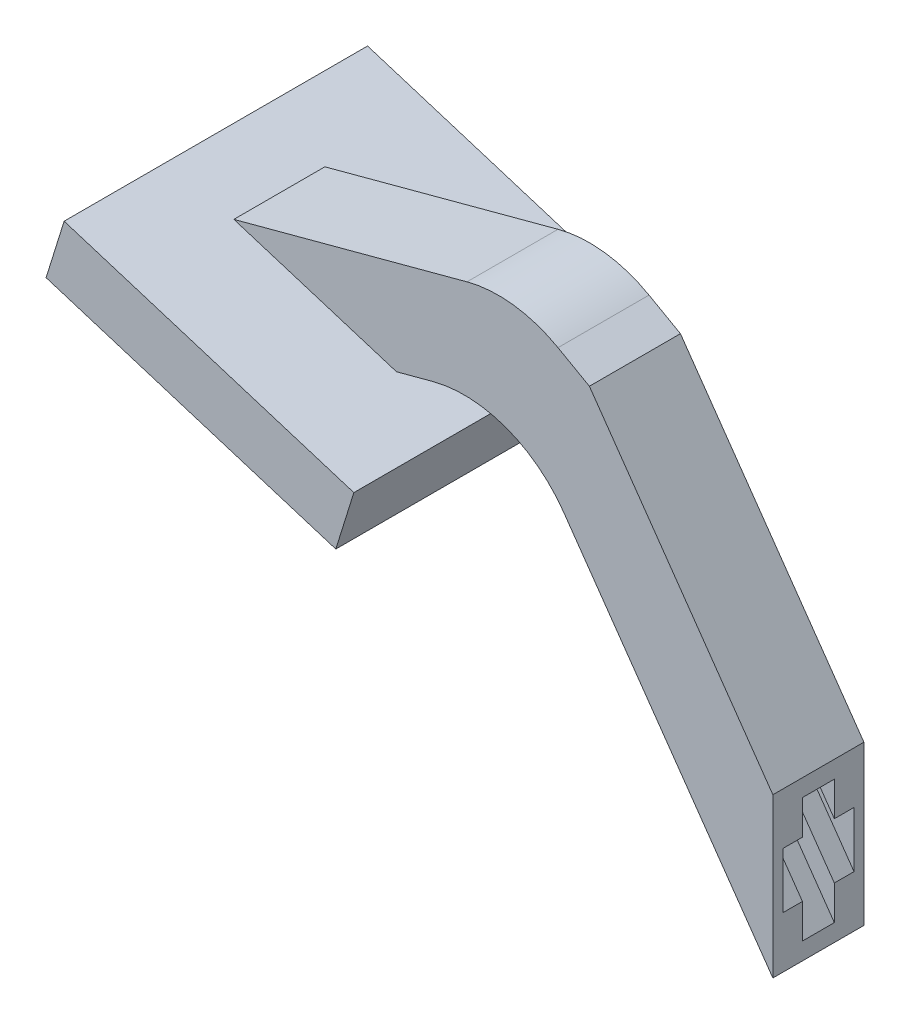
ISO-10303-21;
HEADER;
FILE_DESCRIPTION(('STEP AP214'),'2;1');
FILE_NAME('part.step','',(''),(''),'','','');
FILE_SCHEMA(('AUTOMOTIVE_DESIGN { 1 0 10303 214 1 1 1 1 }'));
ENDSEC;
DATA;
#1=APPLICATION_CONTEXT('core data for automotive mechanical design processes');
#2=APPLICATION_PROTOCOL_DEFINITION('international standard','automotive_design',2000,#1);
#3=PRODUCT_CONTEXT('',#1,'mechanical');
#4=PRODUCT('Part','Part','',(#3));
#5=PRODUCT_RELATED_PRODUCT_CATEGORY('part','',(#4));
#6=PRODUCT_DEFINITION_FORMATION('','',#4);
#7=PRODUCT_DEFINITION_CONTEXT('part definition',#1,'design');
#8=PRODUCT_DEFINITION('design','',#6,#7);
#9=PRODUCT_DEFINITION_SHAPE('','',#8);
#10=(LENGTH_UNIT() NAMED_UNIT(*) SI_UNIT(.MILLI.,.METRE.));
#11=(NAMED_UNIT(*) PLANE_ANGLE_UNIT() SI_UNIT($,.RADIAN.));
#12=(NAMED_UNIT(*) SI_UNIT($,.STERADIAN.) SOLID_ANGLE_UNIT());
#13=UNCERTAINTY_MEASURE_WITH_UNIT(LENGTH_MEASURE(1.E-05),#10,'distance_accuracy_value','');
#14=(GEOMETRIC_REPRESENTATION_CONTEXT(3) GLOBAL_UNCERTAINTY_ASSIGNED_CONTEXT((#13)) GLOBAL_UNIT_ASSIGNED_CONTEXT((#10,
#11,#12)) REPRESENTATION_CONTEXT('',''));
#15=CARTESIAN_POINT('',(0.,0.,0.));
#16=DIRECTION('',(0.,0.,1.));
#17=DIRECTION('',(1.,0.,0.));
#18=AXIS2_PLACEMENT_3D('',#15,#16,#17);
#19=CARTESIAN_POINT('',(-76.7371534076431,20.4290583488844,-5.25000000000002));
#20=DIRECTION('',(0.,0.,-1.));
#21=DIRECTION('',(-1.,3.63042929052426E-13,0.));
#22=AXIS2_PLACEMENT_3D('',#19,#20,#21);
#23=PLANE('',#22);
#24=DIRECTION('',(0.,1.,0.));
#25=VECTOR('',#24,1.);
#26=CARTESIAN_POINT('',(-88.7764695087538,20.4290583488844,-5.25000000000002));
#27=LINE('',#26,#25);
#28=CARTESIAN_POINT('',(-88.7764695087538,44.9863722961307,-5.25000000000002));
#29=VERTEX_POINT('',#28);
#30=CARTESIAN_POINT('',(-88.7764695087538,63.2925636501523,-5.25000000000002));
#31=VERTEX_POINT('',#30);
#32=EDGE_CURVE('E528',#29,#31,#27,.T.);
#33=ORIENTED_EDGE('',*,*,#32,.F.);
#34=DIRECTION('',(0.573576436351044,-0.819152044288993,0.));
#35=VECTOR('',#34,1.);
#36=CARTESIAN_POINT('',(-59.4599154259849,3.1179940182768,-5.25000000000002));
#37=LINE('',#36,#35);
#38=CARTESIAN_POINT('',(-112.919253139753,79.4658406159482,-5.25000000000002));
#39=VERTEX_POINT('',#38);
#40=EDGE_CURVE('E505',#39,#29,#37,.T.);
#41=ORIENTED_EDGE('',*,*,#40,.F.);
#42=CARTESIAN_POINT('',(-124.387381759799,71.4357705070336,-5.25000000000002));
#43=DIRECTION('',(0.,0.,1.));
#44=DIRECTION('',(-1.,0.,0.));
#45=AXIS2_PLACEMENT_3D('',#42,#43,#44);
#46=CIRCLE('',#45,14.);
#47=CARTESIAN_POINT('',(-128.010848391234,84.9587320750806,-5.25000000000002));
#48=VERTEX_POINT('',#47);
#49=EDGE_CURVE('E470',#48,#39,#46,.F.);
#50=ORIENTED_EDGE('',*,*,#49,.F.);
#51=DIRECTION('',(-0.96592582628907,-0.258819045102514,0.));
#52=VECTOR('',#51,1.);
#53=CARTESIAN_POINT('',(-57.1177246506715,103.954487330283,-5.25000000000002));
#54=LINE('',#53,#52);
#55=CARTESIAN_POINT('',(-132.186310495416,83.8399203762381,-5.25000000000002));
#56=VERTEX_POINT('',#55);
#57=EDGE_CURVE('E429',#48,#56,#54,.T.);
#58=ORIENTED_EDGE('',*,*,#57,.T.);
#59=DIRECTION('',(-0.954811797841028,0.297211087787087,0.));
#60=VECTOR('',#59,1.);
#61=CARTESIAN_POINT('',(-150.953412824955,89.681690357072,-5.25000000000002));
#62=LINE('',#61,#60);
#63=CARTESIAN_POINT('',(-150.953412824955,89.681690357072,-5.25000000000002));
#64=VERTEX_POINT('',#63);
#65=EDGE_CURVE('E516',#56,#64,#62,.T.);
#66=ORIENTED_EDGE('',*,*,#65,.T.);
#67=DIRECTION('',(-0.96592582628907,-0.258819045102514,0.));
#68=VECTOR('',#67,1.);
#69=CARTESIAN_POINT('',(-59.8353246242478,114.096708506319,-5.25000000000002));
#70=LINE('',#69,#68);
#71=CARTESIAN_POINT('',(-124.061546630546,96.8873441868295,-5.25000000000002));
#72=VERTEX_POINT('',#71);
#73=EDGE_CURVE('E504',#72,#64,#70,.T.);
#74=ORIENTED_EDGE('',*,*,#73,.F.);
#75=CARTESIAN_POINT('',(-120.438079999111,83.3643826187825,-5.25000000000002));
#76=DIRECTION('',(0.,0.,1.));
#77=DIRECTION('',(-1.,0.,0.));
#78=AXIS2_PLACEMENT_3D('',#75,#76,#77);
#79=CIRCLE('',#78,14.);
#80=CARTESIAN_POINT('',(-113.563943839139,95.5605398846659,-5.25000000000002));
#81=VERTEX_POINT('',#80);
#82=EDGE_CURVE('E484',#81,#72,#79,.T.);
#83=ORIENTED_EDGE('',*,*,#82,.F.);
#84=DIRECTION('',(0.871154090420242,-0.491009725712312,0.));
#85=VECTOR('',#84,1.);
#86=CARTESIAN_POINT('',(-21.6044223151347,43.7292738243126,-5.25000000000002));
#87=LINE('',#86,#85);
#88=CARTESIAN_POINT('',(-109.940872297333,93.5184633065486,-5.25000000000002));
#89=VERTEX_POINT('',#88);
#90=EDGE_CURVE('E513',#81,#89,#87,.T.);
#91=ORIENTED_EDGE('',*,*,#90,.T.);
#92=DIRECTION('',(-0.573576436351044,0.819152044288993,0.));
#93=VECTOR('',#92,1.);
#94=CARTESIAN_POINT('',(-50.8588189609505,9.14054659996277,-5.25000000000002));
#95=LINE('',#94,#93);
#96=EDGE_CURVE('E491',#31,#89,#95,.T.);
#97=ORIENTED_EDGE('',*,*,#96,.F.);
#98=EDGE_LOOP('',(#33,#41,#50,#58,#66,#74,#83,#91,#97));
#99=FACE_BOUND('',#98,.T.);
#100=ADVANCED_FACE('F222',(#99),#23,.T.);
#101=CARTESIAN_POINT('',(-59.4599154259849,3.1179940182768,100.697652672067));
#102=DIRECTION('',(-0.819152044288993,-0.573576436351044,0.));
#103=DIRECTION('',(-0.573576436351044,0.819152044288993,0.));
#104=AXIS2_PLACEMENT_3D('',#101,#102,#103);
#105=PLANE('',#104);
#106=DIRECTION('',(0.,0.,1.));
#107=VECTOR('',#106,1.);
#108=CARTESIAN_POINT('',(-88.7764695087538,44.9863722961307,-9.75000000000002));
#109=LINE('',#108,#107);
#110=CARTESIAN_POINT('',(-88.7764695087538,44.9863722961307,5.24999999999998));
#111=VERTEX_POINT('',#110);
#112=EDGE_CURVE('E246',#29,#111,#109,.T.);
#113=ORIENTED_EDGE('',*,*,#112,.T.);
#114=DIRECTION('',(0.573576436351044,-0.819152044288993,0.));
#115=VECTOR('',#114,1.);
#116=CARTESIAN_POINT('',(-59.4599154259849,3.1179940182768,5.24999999999999));
#117=LINE('',#116,#115);
#118=CARTESIAN_POINT('',(-112.919253139753,79.4658406159482,5.24999999999999));
#119=VERTEX_POINT('',#118);
#120=EDGE_CURVE('E481',#119,#111,#117,.T.);
#121=ORIENTED_EDGE('',*,*,#120,.F.);
#122=DIRECTION('',(0.,0.,-1.));
#123=VECTOR('',#122,1.);
#124=CARTESIAN_POINT('',(-112.919253139753,79.4658406159482,100.697652672067));
#125=LINE('',#124,#123);
#126=EDGE_CURVE('E473',#39,#119,#125,.F.);
#127=ORIENTED_EDGE('',*,*,#126,.F.);
#128=ORIENTED_EDGE('',*,*,#40,.T.);
#129=EDGE_LOOP('',(#113,#121,#127,#128));
#130=FACE_BOUND('',#129,.T.);
#131=ADVANCED_FACE('F629',(#130),#105,.T.);
#132=CARTESIAN_POINT('',(-57.1177246506715,103.954487330283,100.697652672067));
#133=DIRECTION('',(-0.258819045102514,0.96592582628907,0.));
#134=DIRECTION('',(0.96592582628907,0.258819045102514,0.));
#135=AXIS2_PLACEMENT_3D('',#132,#133,#134);
#136=PLANE('',#135);
#137=DIRECTION('',(-0.96592582628907,-0.258819045102514,0.));
#138=VECTOR('',#137,1.);
#139=CARTESIAN_POINT('',(-57.1177246506715,103.954487330283,5.24999999999999));
#140=LINE('',#139,#138);
#141=CARTESIAN_POINT('',(-128.010848391234,84.9587320750806,5.24999999999999));
#142=VERTEX_POINT('',#141);
#143=CARTESIAN_POINT('',(-132.186310495416,83.8399203762381,5.24999999999999));
#144=VERTEX_POINT('',#143);
#145=EDGE_CURVE('E501',#142,#144,#140,.T.);
#146=ORIENTED_EDGE('',*,*,#145,.T.);
#147=DIRECTION('',(0.,0.,1.));
#148=VECTOR('',#147,1.);
#149=CARTESIAN_POINT('',(-132.186310495416,83.8399203762381,-5.25000000000002));
#150=LINE('',#149,#148);
#151=EDGE_CURVE('E496',#56,#144,#150,.T.);
#152=ORIENTED_EDGE('',*,*,#151,.F.);
#153=ORIENTED_EDGE('',*,*,#57,.F.);
#154=DIRECTION('',(0.,0.,-1.));
#155=VECTOR('',#154,1.);
#156=CARTESIAN_POINT('',(-128.010848391234,84.9587320750806,100.697652672067));
#157=LINE('',#156,#155);
#158=EDGE_CURVE('E468',#142,#48,#157,.T.);
#159=ORIENTED_EDGE('',*,*,#158,.F.);
#160=EDGE_LOOP('',(#146,#152,#153,#159));
#161=FACE_BOUND('',#160,.T.);
#162=ADVANCED_FACE('F635',(#161),#136,.F.);
#163=CARTESIAN_POINT('',(-59.8353246242478,114.096708506319,100.697652672067));
#164=DIRECTION('',(-0.258819045102514,0.96592582628907,0.));
#165=DIRECTION('',(0.96592582628907,0.258819045102514,0.));
#166=AXIS2_PLACEMENT_3D('',#163,#164,#165);
#167=PLANE('',#166);
#168=ORIENTED_EDGE('',*,*,#73,.T.);
#169=DIRECTION('',(0.,0.,-1.));
#170=VECTOR('',#169,1.);
#171=CARTESIAN_POINT('',(-150.953412824955,89.681690357072,100.697652672067));
#172=LINE('',#171,#170);
#173=CARTESIAN_POINT('',(-150.953412824955,89.681690357072,5.24999999999998));
#174=VERTEX_POINT('',#173);
#175=EDGE_CURVE('E493',#174,#64,#172,.T.);
#176=ORIENTED_EDGE('',*,*,#175,.F.);
#177=DIRECTION('',(-0.96592582628907,-0.258819045102514,0.));
#178=VECTOR('',#177,1.);
#179=CARTESIAN_POINT('',(-59.8353246242478,114.096708506319,5.24999999999999));
#180=LINE('',#179,#178);
#181=CARTESIAN_POINT('',(-124.061546630546,96.8873441868295,5.24999999999999));
#182=VERTEX_POINT('',#181);
#183=EDGE_CURVE('E500',#182,#174,#180,.T.);
#184=ORIENTED_EDGE('',*,*,#183,.F.);
#185=DIRECTION('',(0.,0.,-1.));
#186=VECTOR('',#185,1.);
#187=CARTESIAN_POINT('',(-124.061546630546,96.8873441868295,5.24999999999999));
#188=LINE('',#187,#186);
#189=EDGE_CURVE('E469',#72,#182,#188,.F.);
#190=ORIENTED_EDGE('',*,*,#189,.F.);
#191=EDGE_LOOP('',(#168,#176,#184,#190));
#192=FACE_BOUND('',#191,.T.);
#193=ADVANCED_FACE('F901',(#192),#167,.T.);
#194=CARTESIAN_POINT('',(-21.6044223151347,43.7292738243126,100.697652672067));
#195=DIRECTION('',(-0.491009725712312,-0.871154090420242,0.));
#196=DIRECTION('',(-0.871154090420242,0.491009725712312,0.));
#197=AXIS2_PLACEMENT_3D('',#194,#195,#196);
#198=PLANE('',#197);
#199=DIRECTION('',(0.871154090420242,-0.491009725712312,0.));
#200=VECTOR('',#199,1.);
#201=CARTESIAN_POINT('',(-21.6044223151347,43.7292738243126,5.24999999999999));
#202=LINE('',#201,#200);
#203=CARTESIAN_POINT('',(-113.563943839139,95.5605398846659,5.24999999999999));
#204=VERTEX_POINT('',#203);
#205=CARTESIAN_POINT('',(-109.940872297333,93.5184633065486,5.24999999999999));
#206=VERTEX_POINT('',#205);
#207=EDGE_CURVE('E492',#204,#206,#202,.T.);
#208=ORIENTED_EDGE('',*,*,#207,.T.);
#209=DIRECTION('',(0.,0.,-1.));
#210=VECTOR('',#209,1.);
#211=CARTESIAN_POINT('',(-109.940872297333,93.5184633065486,100.697652672067));
#212=LINE('',#211,#210);
#213=EDGE_CURVE('E488',#206,#89,#212,.T.);
#214=ORIENTED_EDGE('',*,*,#213,.T.);
#215=ORIENTED_EDGE('',*,*,#90,.F.);
#216=DIRECTION('',(0.,0.,-1.));
#217=VECTOR('',#216,1.);
#218=CARTESIAN_POINT('',(-113.563943839139,95.5605398846659,-5.25000000000002));
#219=LINE('',#218,#217);
#220=EDGE_CURVE('E480',#204,#81,#219,.T.);
#221=ORIENTED_EDGE('',*,*,#220,.F.);
#222=EDGE_LOOP('',(#208,#214,#215,#221));
#223=FACE_BOUND('',#222,.T.);
#224=ADVANCED_FACE('F890',(#223),#198,.F.);
#225=CARTESIAN_POINT('',(-50.8588189609505,9.14054659996277,100.697652672067));
#226=DIRECTION('',(0.819152044288993,0.573576436351044,0.));
#227=DIRECTION('',(0.573576436351044,-0.819152044288993,0.));
#228=AXIS2_PLACEMENT_3D('',#225,#226,#227);
#229=PLANE('',#228);
#230=DIRECTION('',(0.,0.,1.));
#231=VECTOR('',#230,1.);
#232=CARTESIAN_POINT('',(-88.7764695087538,63.2925636501523,-9.75000000000002));
#233=LINE('',#232,#231);
#234=CARTESIAN_POINT('',(-88.7764695087538,63.2925636501523,5.24999999999999));
#235=VERTEX_POINT('',#234);
#236=EDGE_CURVE('E559',#31,#235,#233,.T.);
#237=ORIENTED_EDGE('',*,*,#236,.F.);
#238=ORIENTED_EDGE('',*,*,#96,.T.);
#239=ORIENTED_EDGE('',*,*,#213,.F.);
#240=DIRECTION('',(-0.573576436351044,0.819152044288993,0.));
#241=VECTOR('',#240,1.);
#242=CARTESIAN_POINT('',(-50.8588189609505,9.14054659996277,5.24999999999999));
#243=LINE('',#242,#241);
#244=EDGE_CURVE('E508',#235,#206,#243,.T.);
#245=ORIENTED_EDGE('',*,*,#244,.F.);
#246=EDGE_LOOP('',(#237,#238,#239,#245));
#247=FACE_BOUND('',#246,.T.);
#248=ADVANCED_FACE('F640',(#247),#229,.T.);
#249=CARTESIAN_POINT('',(-76.7371534076431,20.4290583488844,5.24999999999998));
#250=DIRECTION('',(0.,0.,1.));
#251=DIRECTION('',(-1.,3.63042929052426E-13,0.));
#252=AXIS2_PLACEMENT_3D('',#249,#250,#251);
#253=PLANE('',#252);
#254=DIRECTION('',(0.,-1.,0.));
#255=VECTOR('',#254,1.);
#256=CARTESIAN_POINT('',(-88.7764695087538,0.,5.24999999999998));
#257=LINE('',#256,#255);
#258=EDGE_CURVE('E561',#235,#111,#257,.T.);
#259=ORIENTED_EDGE('',*,*,#258,.F.);
#260=ORIENTED_EDGE('',*,*,#244,.T.);
#261=ORIENTED_EDGE('',*,*,#207,.F.);
#262=CARTESIAN_POINT('',(-120.438079999111,83.3643826187825,5.24999999999999));
#263=DIRECTION('',(0.,0.,-1.));
#264=DIRECTION('',(1.,0.,0.));
#265=AXIS2_PLACEMENT_3D('',#262,#263,#264);
#266=CIRCLE('',#265,14.);
#267=EDGE_CURVE('E478',#182,#204,#266,.T.);
#268=ORIENTED_EDGE('',*,*,#267,.F.);
#269=ORIENTED_EDGE('',*,*,#183,.T.);
#270=DIRECTION('',(-0.954811797841028,0.297211087787087,0.));
#271=VECTOR('',#270,1.);
#272=CARTESIAN_POINT('',(-150.953412824955,89.681690357072,5.24999999999998));
#273=LINE('',#272,#271);
#274=EDGE_CURVE('E525',#144,#174,#273,.T.);
#275=ORIENTED_EDGE('',*,*,#274,.F.);
#276=ORIENTED_EDGE('',*,*,#145,.F.);
#277=CARTESIAN_POINT('',(-124.387381759799,71.4357705070336,5.24999999999999));
#278=DIRECTION('',(0.,0.,-1.));
#279=DIRECTION('',(1.,0.,0.));
#280=AXIS2_PLACEMENT_3D('',#277,#278,#279);
#281=CIRCLE('',#280,14.);
#282=EDGE_CURVE('E466',#119,#142,#281,.F.);
#283=ORIENTED_EDGE('',*,*,#282,.F.);
#284=ORIENTED_EDGE('',*,*,#120,.T.);
#285=EDGE_LOOP('',(#259,#260,#261,#268,#269,#275,#276,#283,#284));
#286=FACE_BOUND('',#285,.T.);
#287=ADVANCED_FACE('F866',(#286),#253,.T.);
#288=CARTESIAN_POINT('',(-120.438079999111,83.3643826187825,100.697652672067));
#289=DIRECTION('',(0.,0.,1.));
#290=DIRECTION('',(1.,0.,0.));
#291=AXIS2_PLACEMENT_3D('',#288,#289,#290);
#292=CYLINDRICAL_SURFACE('',#291,14.);
#293=ORIENTED_EDGE('',*,*,#267,.T.);
#294=ORIENTED_EDGE('',*,*,#220,.T.);
#295=ORIENTED_EDGE('',*,*,#82,.T.);
#296=ORIENTED_EDGE('',*,*,#189,.T.);
#297=EDGE_LOOP('',(#293,#294,#295,#296));
#298=FACE_BOUND('',#297,.T.);
#299=ADVANCED_FACE('F858',(#298),#292,.T.);
#300=CARTESIAN_POINT('',(-124.387381759799,71.4357705070336,100.697652672067));
#301=DIRECTION('',(0.,0.,-1.));
#302=DIRECTION('',(-1.,0.,0.));
#303=AXIS2_PLACEMENT_3D('',#300,#301,#302);
#304=CYLINDRICAL_SURFACE('',#303,14.);
#305=ORIENTED_EDGE('',*,*,#282,.T.);
#306=ORIENTED_EDGE('',*,*,#158,.T.);
#307=ORIENTED_EDGE('',*,*,#49,.T.);
#308=ORIENTED_EDGE('',*,*,#126,.T.);
#309=EDGE_LOOP('',(#305,#306,#307,#308));
#310=FACE_BOUND('',#309,.T.);
#311=ADVANCED_FACE('F646',(#310),#304,.F.);
#312=CARTESIAN_POINT('',(-160.359545736913,85.2783168180419,17.5));
#313=DIRECTION('',(0.954811797841028,-0.297211087787087,0.));
#314=DIRECTION('',(0.297211087787087,0.954811797841028,0.));
#315=AXIS2_PLACEMENT_3D('',#312,#313,#314);
#316=PLANE('',#315);
#317=DIRECTION('',(0.,0.,-1.));
#318=VECTOR('',#317,1.);
#319=CARTESIAN_POINT('',(-158.279068122404,91.9619994029291,17.5));
#320=LINE('',#319,#318);
#321=CARTESIAN_POINT('',(-158.279068122404,91.9619994029291,17.5));
#322=VERTEX_POINT('',#321);
#323=CARTESIAN_POINT('',(-158.279068122404,91.9619994029291,-17.5));
#324=VERTEX_POINT('',#323);
#325=EDGE_CURVE('E476',#322,#324,#320,.T.);
#326=ORIENTED_EDGE('',*,*,#325,.T.);
#327=DIRECTION('',(0.297211087787087,0.954811797841028,0.));
#328=VECTOR('',#327,1.);
#329=CARTESIAN_POINT('',(-160.359545736913,85.2783168180419,-17.5));
#330=LINE('',#329,#328);
#331=CARTESIAN_POINT('',(-160.359545736913,85.2783168180419,-17.5));
#332=VERTEX_POINT('',#331);
#333=EDGE_CURVE('E530',#332,#324,#330,.T.);
#334=ORIENTED_EDGE('',*,*,#333,.F.);
#335=DIRECTION('',(0.,0.,-1.));
#336=VECTOR('',#335,1.);
#337=CARTESIAN_POINT('',(-160.359545736913,85.2783168180419,17.5));
#338=LINE('',#337,#336);
#339=CARTESIAN_POINT('',(-160.359545736913,85.2783168180419,17.5));
#340=VERTEX_POINT('',#339);
#341=EDGE_CURVE('E542',#340,#332,#338,.T.);
#342=ORIENTED_EDGE('',*,*,#341,.F.);
#343=DIRECTION('',(0.297211087787087,0.954811797841028,0.));
#344=VECTOR('',#343,1.);
#345=CARTESIAN_POINT('',(-160.359545736913,85.2783168180419,17.5));
#346=LINE('',#345,#344);
#347=EDGE_CURVE('E543',#340,#322,#346,.T.);
#348=ORIENTED_EDGE('',*,*,#347,.T.);
#349=EDGE_LOOP('',(#326,#334,#342,#348));
#350=FACE_BOUND('',#349,.T.);
#351=ADVANCED_FACE('F642',(#350),#316,.F.);
#352=CARTESIAN_POINT('',(-126.941132812477,74.8759287454939,-17.5));
#353=DIRECTION('',(0.,0.,1.));
#354=DIRECTION('',(1.,0.,0.));
#355=AXIS2_PLACEMENT_3D('',#352,#353,#354);
#356=PLANE('',#355);
#357=DIRECTION('',(0.954811797841028,-0.297211087787087,0.));
#358=VECTOR('',#357,1.);
#359=CARTESIAN_POINT('',(-124.860655197968,81.5596113303811,-17.5));
#360=LINE('',#359,#358);
#361=CARTESIAN_POINT('',(-124.860655197968,81.5596113303811,-17.5));
#362=VERTEX_POINT('',#361);
#363=EDGE_CURVE('E534',#324,#362,#360,.T.);
#364=ORIENTED_EDGE('',*,*,#363,.T.);
#365=DIRECTION('',(0.297211087787087,0.954811797841028,0.));
#366=VECTOR('',#365,1.);
#367=CARTESIAN_POINT('',(-126.941132812477,74.8759287454939,-17.5));
#368=LINE('',#367,#366);
#369=CARTESIAN_POINT('',(-126.941132812477,74.8759287454939,-17.5));
#370=VERTEX_POINT('',#369);
#371=EDGE_CURVE('E535',#370,#362,#368,.T.);
#372=ORIENTED_EDGE('',*,*,#371,.F.);
#373=DIRECTION('',(0.954811797841028,-0.297211087787087,0.));
#374=VECTOR('',#373,1.);
#375=CARTESIAN_POINT('',(-126.941132812477,74.8759287454939,-17.5));
#376=LINE('',#375,#374);
#377=EDGE_CURVE('E554',#332,#370,#376,.T.);
#378=ORIENTED_EDGE('',*,*,#377,.F.);
#379=ORIENTED_EDGE('',*,*,#333,.T.);
#380=EDGE_LOOP('',(#364,#372,#378,#379));
#381=FACE_BOUND('',#380,.T.);
#382=ADVANCED_FACE('F645',(#381),#356,.F.);
#383=CARTESIAN_POINT('',(-126.941132812477,74.8759287454939,17.5));
#384=DIRECTION('',(-0.954811797841028,0.297211087787087,0.));
#385=DIRECTION('',(-0.297211087787087,-0.954811797841028,0.));
#386=AXIS2_PLACEMENT_3D('',#383,#384,#385);
#387=PLANE('',#386);
#388=DIRECTION('',(0.,0.,1.));
#389=VECTOR('',#388,1.);
#390=CARTESIAN_POINT('',(-124.860655197968,81.5596113303811,17.5));
#391=LINE('',#390,#389);
#392=CARTESIAN_POINT('',(-124.860655197968,81.5596113303811,17.5));
#393=VERTEX_POINT('',#392);
#394=EDGE_CURVE('E533',#362,#393,#391,.T.);
#395=ORIENTED_EDGE('',*,*,#394,.T.);
#396=DIRECTION('',(0.297211087787087,0.954811797841028,0.));
#397=VECTOR('',#396,1.);
#398=CARTESIAN_POINT('',(-126.941132812477,74.8759287454939,17.5));
#399=LINE('',#398,#397);
#400=CARTESIAN_POINT('',(-126.941132812477,74.8759287454939,17.5));
#401=VERTEX_POINT('',#400);
#402=EDGE_CURVE('E539',#401,#393,#399,.T.);
#403=ORIENTED_EDGE('',*,*,#402,.F.);
#404=DIRECTION('',(0.,0.,1.));
#405=VECTOR('',#404,1.);
#406=CARTESIAN_POINT('',(-126.941132812477,74.8759287454939,17.5));
#407=LINE('',#406,#405);
#408=EDGE_CURVE('E552',#370,#401,#407,.T.);
#409=ORIENTED_EDGE('',*,*,#408,.F.);
#410=ORIENTED_EDGE('',*,*,#371,.T.);
#411=EDGE_LOOP('',(#395,#403,#409,#410));
#412=FACE_BOUND('',#411,.T.);
#413=ADVANCED_FACE('F650',(#412),#387,.F.);
#414=CARTESIAN_POINT('',(-126.941132812477,74.8759287454939,17.5));
#415=DIRECTION('',(0.,0.,-1.));
#416=DIRECTION('',(-1.,0.,0.));
#417=AXIS2_PLACEMENT_3D('',#414,#415,#416);
#418=PLANE('',#417);
#419=DIRECTION('',(-0.954811797841028,0.297211087787087,0.));
#420=VECTOR('',#419,1.);
#421=CARTESIAN_POINT('',(-124.860655197968,81.5596113303811,17.5));
#422=LINE('',#421,#420);
#423=EDGE_CURVE('E538',#393,#322,#422,.T.);
#424=ORIENTED_EDGE('',*,*,#423,.T.);
#425=ORIENTED_EDGE('',*,*,#347,.F.);
#426=DIRECTION('',(-0.954811797841028,0.297211087787087,0.));
#427=VECTOR('',#426,1.);
#428=CARTESIAN_POINT('',(-126.941132812477,74.8759287454939,17.5));
#429=LINE('',#428,#427);
#430=EDGE_CURVE('E497',#401,#340,#429,.T.);
#431=ORIENTED_EDGE('',*,*,#430,.F.);
#432=ORIENTED_EDGE('',*,*,#402,.T.);
#433=EDGE_LOOP('',(#424,#425,#431,#432));
#434=FACE_BOUND('',#433,.T.);
#435=ADVANCED_FACE('F654',(#434),#418,.F.);
#436=CARTESIAN_POINT('',(-27.4309709983004,43.9006899544198,0.));
#437=DIRECTION('',(0.297211087787087,0.954811797841028,0.));
#438=DIRECTION('',(-0.954811797841028,0.297211087787087,0.));
#439=AXIS2_PLACEMENT_3D('',#436,#437,#438);
#440=PLANE('',#439);
#441=ORIENTED_EDGE('',*,*,#341,.T.);
#442=ORIENTED_EDGE('',*,*,#377,.T.);
#443=ORIENTED_EDGE('',*,*,#408,.T.);
#444=ORIENTED_EDGE('',*,*,#430,.T.);
#445=EDGE_LOOP('',(#441,#442,#443,#444));
#446=FACE_BOUND('',#445,.T.);
#447=ADVANCED_FACE('F658',(#446),#440,.F.);
#448=CARTESIAN_POINT('',(-25.3504933837908,50.584372539307,0.));
#449=DIRECTION('',(0.297211087787087,0.954811797841028,0.));
#450=DIRECTION('',(-0.954811797841028,0.297211087787087,0.));
#451=AXIS2_PLACEMENT_3D('',#448,#449,#450);
#452=PLANE('',#451);
#453=ORIENTED_EDGE('',*,*,#175,.T.);
#454=ORIENTED_EDGE('',*,*,#65,.F.);
#455=ORIENTED_EDGE('',*,*,#151,.T.);
#456=ORIENTED_EDGE('',*,*,#274,.T.);
#457=EDGE_LOOP('',(#453,#454,#455,#456));
#458=FACE_BOUND('',#457,.T.);
#459=ORIENTED_EDGE('',*,*,#325,.F.);
#460=ORIENTED_EDGE('',*,*,#423,.F.);
#461=ORIENTED_EDGE('',*,*,#394,.F.);
#462=ORIENTED_EDGE('',*,*,#363,.F.);
#463=EDGE_LOOP('',(#459,#460,#461,#462));
#464=FACE_BOUND('',#463,.T.);
#465=ADVANCED_FACE('F660',(#458,#464),#452,.T.);
#466=CARTESIAN_POINT('',(-88.7764695087538,0.,-9.75000000000002));
#467=DIRECTION('',(-1.,0.,0.));
#468=DIRECTION('',(0.,0.,1.));
#469=AXIS2_PLACEMENT_3D('',#466,#467,#468);
#470=PLANE('',#469);
#471=DIRECTION('',(0.,0.,-1.));
#472=VECTOR('',#471,1.);
#473=CARTESIAN_POINT('',(-88.7764695087538,46.9739016431388,-9.75000000000002));
#474=LINE('',#473,#472);
#475=CARTESIAN_POINT('',(-88.7764695087538,46.9739016431388,1.84));
#476=VERTEX_POINT('',#475);
#477=CARTESIAN_POINT('',(-88.7764695087538,46.9739016431388,-1.84));
#478=VERTEX_POINT('',#477);
#479=EDGE_CURVE('E572',#476,#478,#474,.T.);
#480=ORIENTED_EDGE('',*,*,#479,.F.);
#481=DIRECTION('',(0.,1.,0.));
#482=VECTOR('',#481,1.);
#483=CARTESIAN_POINT('',(-88.7764695087538,0.,1.84));
#484=LINE('',#483,#482);
#485=CARTESIAN_POINT('',(-88.7764695087538,50.9315258691987,1.84));
#486=VERTEX_POINT('',#485);
#487=EDGE_CURVE('E12',#476,#486,#484,.T.);
#488=ORIENTED_EDGE('',*,*,#487,.T.);
#489=DIRECTION('',(0.,0.,-1.));
#490=VECTOR('',#489,1.);
#491=CARTESIAN_POINT('',(-88.7764695087538,50.9315258691987,-9.75000000000002));
#492=LINE('',#491,#490);
#493=CARTESIAN_POINT('',(-88.7764695087538,50.9315258691987,4.11));
#494=VERTEX_POINT('',#493);
#495=EDGE_CURVE('E230',#494,#486,#492,.T.);
#496=ORIENTED_EDGE('',*,*,#495,.F.);
#497=DIRECTION('',(0.,-1.,0.));
#498=VECTOR('',#497,1.);
#499=CARTESIAN_POINT('',(-88.7764695087538,0.,4.11));
#500=LINE('',#499,#498);
#501=CARTESIAN_POINT('',(-88.7764695087538,57.3474100770844,4.11));
#502=VERTEX_POINT('',#501);
#503=EDGE_CURVE('E585',#502,#494,#500,.T.);
#504=ORIENTED_EDGE('',*,*,#503,.F.);
#505=DIRECTION('',(0.,0.,-1.));
#506=VECTOR('',#505,1.);
#507=CARTESIAN_POINT('',(-88.7764695087538,57.3474100770844,-9.75000000000002));
#508=LINE('',#507,#506);
#509=CARTESIAN_POINT('',(-88.7764695087538,57.3474100770843,1.84));
#510=VERTEX_POINT('',#509);
#511=EDGE_CURVE('E582',#502,#510,#508,.T.);
#512=ORIENTED_EDGE('',*,*,#511,.T.);
#513=DIRECTION('',(0.,1.,0.));
#514=VECTOR('',#513,1.);
#515=CARTESIAN_POINT('',(-88.7764695087538,0.,1.84));
#516=LINE('',#515,#514);
#517=CARTESIAN_POINT('',(-88.7764695087538,61.3050343031442,1.84));
#518=VERTEX_POINT('',#517);
#519=EDGE_CURVE('E579',#510,#518,#516,.T.);
#520=ORIENTED_EDGE('',*,*,#519,.T.);
#521=DIRECTION('',(0.,0.,-1.));
#522=VECTOR('',#521,1.);
#523=CARTESIAN_POINT('',(-88.7764695087538,61.3050343031442,-9.75000000000002));
#524=LINE('',#523,#522);
#525=CARTESIAN_POINT('',(-88.7764695087538,61.3050343031443,-1.84));
#526=VERTEX_POINT('',#525);
#527=EDGE_CURVE('E576',#518,#526,#524,.T.);
#528=ORIENTED_EDGE('',*,*,#527,.T.);
#529=DIRECTION('',(0.,1.,0.));
#530=VECTOR('',#529,1.);
#531=CARTESIAN_POINT('',(-88.7764695087538,0.,-1.84));
#532=LINE('',#531,#530);
#533=CARTESIAN_POINT('',(-88.7764695087538,57.3474100770843,-1.84));
#534=VERTEX_POINT('',#533);
#535=EDGE_CURVE('E574',#534,#526,#532,.T.);
#536=ORIENTED_EDGE('',*,*,#535,.F.);
#537=DIRECTION('',(0.,0.,-1.));
#538=VECTOR('',#537,1.);
#539=CARTESIAN_POINT('',(-88.7764695087538,57.3474100770844,-9.75000000000002));
#540=LINE('',#539,#538);
#541=CARTESIAN_POINT('',(-88.7764695087538,57.3474100770844,-4.11));
#542=VERTEX_POINT('',#541);
#543=EDGE_CURVE('E396',#534,#542,#540,.T.);
#544=ORIENTED_EDGE('',*,*,#543,.T.);
#545=DIRECTION('',(0.,-1.,0.));
#546=VECTOR('',#545,1.);
#547=CARTESIAN_POINT('',(-88.7764695087538,0.,-4.11));
#548=LINE('',#547,#546);
#549=CARTESIAN_POINT('',(-88.7764695087538,50.9315258691987,-4.11));
#550=VERTEX_POINT('',#549);
#551=EDGE_CURVE('E564',#542,#550,#548,.T.);
#552=ORIENTED_EDGE('',*,*,#551,.T.);
#553=DIRECTION('',(0.,0.,-1.));
#554=VECTOR('',#553,1.);
#555=CARTESIAN_POINT('',(-88.7764695087538,50.9315258691987,-9.75000000000002));
#556=LINE('',#555,#554);
#557=CARTESIAN_POINT('',(-88.7764695087538,50.9315258691987,-1.84));
#558=VERTEX_POINT('',#557);
#559=EDGE_CURVE('E568',#558,#550,#556,.T.);
#560=ORIENTED_EDGE('',*,*,#559,.F.);
#561=DIRECTION('',(0.,1.,0.));
#562=VECTOR('',#561,1.);
#563=CARTESIAN_POINT('',(-88.7764695087538,0.,-1.84));
#564=LINE('',#563,#562);
#565=EDGE_CURVE('E570',#478,#558,#564,.T.);
#566=ORIENTED_EDGE('',*,*,#565,.F.);
#567=EDGE_LOOP('',(#480,#488,#496,#504,#512,#520,#528,#536,#544,#552,#560,#566));
#568=FACE_BOUND('',#567,.T.);
#569=ORIENTED_EDGE('',*,*,#32,.T.);
#570=ORIENTED_EDGE('',*,*,#236,.T.);
#571=ORIENTED_EDGE('',*,*,#258,.T.);
#572=ORIENTED_EDGE('',*,*,#112,.F.);
#573=EDGE_LOOP('',(#569,#570,#571,#572));
#574=FACE_BOUND('',#573,.T.);
#575=ADVANCED_FACE('F224',(#568,#574),#470,.F.);
#576=CARTESIAN_POINT('',(-67.5505384735435,96.472166875348,1.84));
#577=DIRECTION('',(0.,0.,1.));
#578=DIRECTION('',(1.,0.,0.));
#579=AXIS2_PLACEMENT_3D('',#576,#577,#578);
#580=PLANE('',#579);
#581=DIRECTION('',(0.573576436351045,-0.819152044288993,0.));
#582=VECTOR('',#581,1.);
#583=CARTESIAN_POINT('',(-100.175974605276,73.6275905585294,1.84));
#584=LINE('',#583,#582);
#585=CARTESIAN_POINT('',(-100.175974605276,73.6275905585294,1.84));
#586=VERTEX_POINT('',#585);
#587=EDGE_CURVE('E426',#586,#510,#584,.T.);
#588=ORIENTED_EDGE('',*,*,#587,.F.);
#589=DIRECTION('',(-0.819152044288993,-0.573576436351045,0.));
#590=VECTOR('',#589,1.);
#591=CARTESIAN_POINT('',(-67.5505384735435,96.472166875348,1.84));
#592=LINE('',#591,#590);
#593=CARTESIAN_POINT('',(-98.3164994647401,74.9296090690463,1.84));
#594=VERTEX_POINT('',#593);
#595=EDGE_CURVE('E401',#594,#586,#592,.T.);
#596=ORIENTED_EDGE('',*,*,#595,.F.);
#597=DIRECTION('',(0.573576436351045,-0.819152044288993,0.));
#598=VECTOR('',#597,1.);
#599=CARTESIAN_POINT('',(-98.3164994647401,74.9296090690463,1.84));
#600=LINE('',#599,#598);
#601=EDGE_CURVE('E430',#594,#518,#600,.T.);
#602=ORIENTED_EDGE('',*,*,#601,.T.);
#603=ORIENTED_EDGE('',*,*,#519,.F.);
#604=EDGE_LOOP('',(#588,#596,#602,#603));
#605=FACE_BOUND('',#604,.T.);
#606=ADVANCED_FACE('F615',(#605),#580,.F.);
#607=CARTESIAN_POINT('',(-98.3164994647401,74.9296090690463,0.));
#608=DIRECTION('',(0.819152044288993,0.573576436351045,0.));
#609=DIRECTION('',(-0.573576436351045,0.819152044288993,0.));
#610=AXIS2_PLACEMENT_3D('',#607,#608,#609);
#611=PLANE('',#610);
#612=ORIENTED_EDGE('',*,*,#601,.F.);
#613=DIRECTION('',(0.,0.,1.));
#614=VECTOR('',#613,1.);
#615=CARTESIAN_POINT('',(-98.3164994647401,74.9296090690463,0.));
#616=LINE('',#615,#614);
#617=CARTESIAN_POINT('',(-98.3164994647401,74.9296090690463,-1.84));
#618=VERTEX_POINT('',#617);
#619=EDGE_CURVE('E416',#618,#594,#616,.T.);
#620=ORIENTED_EDGE('',*,*,#619,.F.);
#621=DIRECTION('',(0.573576436351045,-0.819152044288993,0.));
#622=VECTOR('',#621,1.);
#623=CARTESIAN_POINT('',(-98.3164994647401,74.9296090690463,-1.84));
#624=LINE('',#623,#622);
#625=EDGE_CURVE('E400',#618,#526,#624,.T.);
#626=ORIENTED_EDGE('',*,*,#625,.T.);
#627=ORIENTED_EDGE('',*,*,#527,.F.);
#628=EDGE_LOOP('',(#612,#620,#626,#627));
#629=FACE_BOUND('',#628,.T.);
#630=ADVANCED_FACE('F617',(#629),#611,.F.);
#631=CARTESIAN_POINT('',(-67.5505384735435,96.472166875348,-1.84));
#632=DIRECTION('',(0.,0.,1.));
#633=DIRECTION('',(1.,0.,0.));
#634=AXIS2_PLACEMENT_3D('',#631,#632,#633);
#635=PLANE('',#634);
#636=ORIENTED_EDGE('',*,*,#535,.T.);
#637=ORIENTED_EDGE('',*,*,#625,.F.);
#638=DIRECTION('',(-0.819152044288993,-0.573576436351045,0.));
#639=VECTOR('',#638,1.);
#640=CARTESIAN_POINT('',(-67.5505384735435,96.472166875348,-1.84));
#641=LINE('',#640,#639);
#642=CARTESIAN_POINT('',(-100.175974605276,73.6275905585294,-1.84));
#643=VERTEX_POINT('',#642);
#644=EDGE_CURVE('E407',#618,#643,#641,.T.);
#645=ORIENTED_EDGE('',*,*,#644,.T.);
#646=DIRECTION('',(0.573576436351045,-0.819152044288993,0.));
#647=VECTOR('',#646,1.);
#648=CARTESIAN_POINT('',(-100.175974605276,73.6275905585294,-1.84));
#649=LINE('',#648,#647);
#650=EDGE_CURVE('E389',#643,#534,#649,.T.);
#651=ORIENTED_EDGE('',*,*,#650,.T.);
#652=EDGE_LOOP('',(#636,#637,#645,#651));
#653=FACE_BOUND('',#652,.T.);
#654=ADVANCED_FACE('F414',(#653),#635,.T.);
#655=CARTESIAN_POINT('',(-105.049929268796,70.2148107622407,0.));
#656=DIRECTION('',(0.819152044288993,0.573576436351045,0.));
#657=DIRECTION('',(-0.573576436351045,0.819152044288993,0.));
#658=AXIS2_PLACEMENT_3D('',#655,#656,#657);
#659=PLANE('',#658);
#660=ORIENTED_EDGE('',*,*,#479,.T.);
#661=DIRECTION('',(0.573576436351045,-0.819152044288993,0.));
#662=VECTOR('',#661,1.);
#663=CARTESIAN_POINT('',(-105.049929268796,70.2148107622407,-1.84));
#664=LINE('',#663,#662);
#665=CARTESIAN_POINT('',(-105.049929268796,70.2148107622407,-1.84));
#666=VERTEX_POINT('',#665);
#667=EDGE_CURVE('E417',#666,#478,#664,.T.);
#668=ORIENTED_EDGE('',*,*,#667,.F.);
#669=DIRECTION('',(0.,0.,1.));
#670=VECTOR('',#669,1.);
#671=CARTESIAN_POINT('',(-105.049929268796,70.2148107622407,0.));
#672=LINE('',#671,#670);
#673=CARTESIAN_POINT('',(-105.049929268796,70.2148107622407,1.84));
#674=VERTEX_POINT('',#673);
#675=EDGE_CURVE('E440',#666,#674,#672,.T.);
#676=ORIENTED_EDGE('',*,*,#675,.T.);
#677=DIRECTION('',(0.573576436351045,-0.819152044288993,0.));
#678=VECTOR('',#677,1.);
#679=CARTESIAN_POINT('',(-105.049929268796,70.2148107622407,1.84));
#680=LINE('',#679,#678);
#681=EDGE_CURVE('E421',#674,#476,#680,.T.);
#682=ORIENTED_EDGE('',*,*,#681,.T.);
#683=EDGE_LOOP('',(#660,#668,#676,#682));
#684=FACE_BOUND('',#683,.T.);
#685=ADVANCED_FACE('F602',(#684),#659,.T.);
#686=CARTESIAN_POINT('',(-67.5505384735435,96.472166875348,-1.84));
#687=DIRECTION('',(0.,0.,1.));
#688=DIRECTION('',(1.,0.,0.));
#689=AXIS2_PLACEMENT_3D('',#686,#687,#688);
#690=PLANE('',#689);
#691=ORIENTED_EDGE('',*,*,#565,.T.);
#692=DIRECTION('',(0.573576436351045,-0.819152044288993,0.));
#693=VECTOR('',#692,1.);
#694=CARTESIAN_POINT('',(-103.19045412826,71.5168292727576,-1.84));
#695=LINE('',#694,#693);
#696=CARTESIAN_POINT('',(-103.19045412826,71.5168292727576,-1.84));
#697=VERTEX_POINT('',#696);
#698=EDGE_CURVE('E441',#697,#558,#695,.T.);
#699=ORIENTED_EDGE('',*,*,#698,.F.);
#700=DIRECTION('',(-0.819152044288993,-0.573576436351045,0.));
#701=VECTOR('',#700,1.);
#702=CARTESIAN_POINT('',(-67.5505384735435,96.472166875348,-1.84));
#703=LINE('',#702,#701);
#704=EDGE_CURVE('E434',#697,#666,#703,.T.);
#705=ORIENTED_EDGE('',*,*,#704,.T.);
#706=ORIENTED_EDGE('',*,*,#667,.T.);
#707=EDGE_LOOP('',(#691,#699,#705,#706));
#708=FACE_BOUND('',#707,.T.);
#709=ADVANCED_FACE('F604',(#708),#690,.T.);
#710=CARTESIAN_POINT('',(-67.5505384735435,96.472166875348,1.84));
#711=DIRECTION('',(0.,0.,1.));
#712=DIRECTION('',(1.,0.,0.));
#713=AXIS2_PLACEMENT_3D('',#710,#711,#712);
#714=PLANE('',#713);
#715=ORIENTED_EDGE('',*,*,#681,.F.);
#716=DIRECTION('',(-0.819152044288993,-0.573576436351045,0.));
#717=VECTOR('',#716,1.);
#718=CARTESIAN_POINT('',(-67.5505384735435,96.472166875348,1.84));
#719=LINE('',#718,#717);
#720=CARTESIAN_POINT('',(-103.19045412826,71.5168292727576,1.84));
#721=VERTEX_POINT('',#720);
#722=EDGE_CURVE('E437',#721,#674,#719,.T.);
#723=ORIENTED_EDGE('',*,*,#722,.F.);
#724=DIRECTION('',(0.573576436351045,-0.819152044288993,0.));
#725=VECTOR('',#724,1.);
#726=CARTESIAN_POINT('',(-103.19045412826,71.5168292727576,1.84));
#727=LINE('',#726,#725);
#728=EDGE_CURVE('E445',#721,#486,#727,.T.);
#729=ORIENTED_EDGE('',*,*,#728,.T.);
#730=ORIENTED_EDGE('',*,*,#487,.F.);
#731=EDGE_LOOP('',(#715,#723,#729,#730));
#732=FACE_BOUND('',#731,.T.);
#733=ADVANCED_FACE('F596',(#732),#714,.F.);
#734=CARTESIAN_POINT('',(-103.19045412826,71.5168292727576,-4.11));
#735=DIRECTION('',(0.819152044288993,0.573576436351045,0.));
#736=DIRECTION('',(-0.573576436351045,0.819152044288993,0.));
#737=AXIS2_PLACEMENT_3D('',#734,#735,#736);
#738=PLANE('',#737);
#739=ORIENTED_EDGE('',*,*,#559,.T.);
#740=DIRECTION('',(0.573576436351045,-0.819152044288993,0.));
#741=VECTOR('',#740,1.);
#742=CARTESIAN_POINT('',(-103.19045412826,71.5168292727576,-4.11));
#743=LINE('',#742,#741);
#744=CARTESIAN_POINT('',(-103.19045412826,71.5168292727576,-4.11));
#745=VERTEX_POINT('',#744);
#746=EDGE_CURVE('E237',#745,#550,#743,.T.);
#747=ORIENTED_EDGE('',*,*,#746,.F.);
#748=DIRECTION('',(0.,0.,1.));
#749=VECTOR('',#748,1.);
#750=CARTESIAN_POINT('',(-103.19045412826,71.5168292727576,-4.11));
#751=LINE('',#750,#749);
#752=EDGE_CURVE('E454',#745,#697,#751,.T.);
#753=ORIENTED_EDGE('',*,*,#752,.T.);
#754=ORIENTED_EDGE('',*,*,#698,.T.);
#755=EDGE_LOOP('',(#739,#747,#753,#754));
#756=FACE_BOUND('',#755,.T.);
#757=ADVANCED_FACE('F725',(#756),#738,.T.);
#758=ORIENTED_EDGE('',*,*,#495,.T.);
#759=ORIENTED_EDGE('',*,*,#728,.F.);
#760=CARTESIAN_POINT('',(-103.19045412826,71.5168292727576,4.11));
#761=VERTEX_POINT('',#760);
#762=EDGE_CURVE('E453',#721,#761,#751,.T.);
#763=ORIENTED_EDGE('',*,*,#762,.T.);
#764=DIRECTION('',(0.573576436351045,-0.819152044288993,0.));
#765=VECTOR('',#764,1.);
#766=CARTESIAN_POINT('',(-103.19045412826,71.5168292727576,4.11));
#767=LINE('',#766,#765);
#768=EDGE_CURVE('E459',#761,#494,#767,.T.);
#769=ORIENTED_EDGE('',*,*,#768,.T.);
#770=EDGE_LOOP('',(#758,#759,#763,#769));
#771=FACE_BOUND('',#770,.T.);
#772=ADVANCED_FACE('F588',(#771),#738,.T.);
#773=CARTESIAN_POINT('',(-103.19045412826,71.5168292727576,4.11));
#774=DIRECTION('',(0.,0.,-1.));
#775=DIRECTION('',(-1.,0.,0.));
#776=AXIS2_PLACEMENT_3D('',#773,#774,#775);
#777=PLANE('',#776);
#778=ORIENTED_EDGE('',*,*,#503,.T.);
#779=ORIENTED_EDGE('',*,*,#768,.F.);
#780=DIRECTION('',(0.819152044288993,0.573576436351044,0.));
#781=VECTOR('',#780,1.);
#782=CARTESIAN_POINT('',(-103.19045412826,71.5168292727576,4.11));
#783=LINE('',#782,#781);
#784=CARTESIAN_POINT('',(-100.175974605276,73.6275905585294,4.11));
#785=VERTEX_POINT('',#784);
#786=EDGE_CURVE('E411',#761,#785,#783,.T.);
#787=ORIENTED_EDGE('',*,*,#786,.T.);
#788=DIRECTION('',(0.573576436351045,-0.819152044288993,0.));
#789=VECTOR('',#788,1.);
#790=CARTESIAN_POINT('',(-100.175974605276,73.6275905585294,4.11));
#791=LINE('',#790,#789);
#792=EDGE_CURVE('E462',#785,#502,#791,.T.);
#793=ORIENTED_EDGE('',*,*,#792,.T.);
#794=EDGE_LOOP('',(#778,#779,#787,#793));
#795=FACE_BOUND('',#794,.T.);
#796=ADVANCED_FACE('F608',(#795),#777,.T.);
#797=CARTESIAN_POINT('',(-100.175974605276,73.6275905585294,-4.11));
#798=DIRECTION('',(0.819152044288993,0.573576436351045,0.));
#799=DIRECTION('',(-0.573576436351045,0.819152044288993,0.));
#800=AXIS2_PLACEMENT_3D('',#797,#798,#799);
#801=PLANE('',#800);
#802=ORIENTED_EDGE('',*,*,#792,.F.);
#803=DIRECTION('',(0.,0.,1.));
#804=VECTOR('',#803,1.);
#805=CARTESIAN_POINT('',(-100.175974605276,73.6275905585294,-4.11));
#806=LINE('',#805,#804);
#807=EDGE_CURVE('E412',#586,#785,#806,.T.);
#808=ORIENTED_EDGE('',*,*,#807,.F.);
#809=ORIENTED_EDGE('',*,*,#587,.T.);
#810=ORIENTED_EDGE('',*,*,#511,.F.);
#811=EDGE_LOOP('',(#802,#808,#809,#810));
#812=FACE_BOUND('',#811,.T.);
#813=ADVANCED_FACE('F611',(#812),#801,.F.);
#814=ORIENTED_EDGE('',*,*,#650,.F.);
#815=CARTESIAN_POINT('',(-100.175974605276,73.6275905585294,-4.11));
#816=VERTEX_POINT('',#815);
#817=EDGE_CURVE('E393',#816,#643,#806,.T.);
#818=ORIENTED_EDGE('',*,*,#817,.F.);
#819=DIRECTION('',(0.573576436351045,-0.819152044288993,0.));
#820=VECTOR('',#819,1.);
#821=CARTESIAN_POINT('',(-100.175974605276,73.6275905585294,-4.11));
#822=LINE('',#821,#820);
#823=EDGE_CURVE('E457',#816,#542,#822,.T.);
#824=ORIENTED_EDGE('',*,*,#823,.T.);
#825=ORIENTED_EDGE('',*,*,#543,.F.);
#826=EDGE_LOOP('',(#814,#818,#824,#825));
#827=FACE_BOUND('',#826,.T.);
#828=ADVANCED_FACE('F391',(#827),#801,.F.);
#829=CARTESIAN_POINT('',(-103.19045412826,71.5168292727576,-4.11));
#830=DIRECTION('',(0.,0.,-1.));
#831=DIRECTION('',(-1.,0.,0.));
#832=AXIS2_PLACEMENT_3D('',#829,#830,#831);
#833=PLANE('',#832);
#834=ORIENTED_EDGE('',*,*,#823,.F.);
#835=DIRECTION('',(0.819152044288993,0.573576436351044,0.));
#836=VECTOR('',#835,1.);
#837=CARTESIAN_POINT('',(-103.19045412826,71.5168292727576,-4.11));
#838=LINE('',#837,#836);
#839=EDGE_CURVE('E410',#745,#816,#838,.T.);
#840=ORIENTED_EDGE('',*,*,#839,.F.);
#841=ORIENTED_EDGE('',*,*,#746,.T.);
#842=ORIENTED_EDGE('',*,*,#551,.F.);
#843=EDGE_LOOP('',(#834,#840,#841,#842));
#844=FACE_BOUND('',#843,.T.);
#845=ADVANCED_FACE('F618',(#844),#833,.F.);
#846=CARTESIAN_POINT('',(-67.5505384735435,96.472166875348,0.));
#847=DIRECTION('',(0.573576436351045,-0.819152044288993,0.));
#848=DIRECTION('',(0.819152044288993,0.573576436351045,0.));
#849=AXIS2_PLACEMENT_3D('',#846,#847,#848);
#850=PLANE('',#849);
#851=ORIENTED_EDGE('',*,*,#644,.F.);
#852=ORIENTED_EDGE('',*,*,#619,.T.);
#853=ORIENTED_EDGE('',*,*,#595,.T.);
#854=ORIENTED_EDGE('',*,*,#807,.T.);
#855=ORIENTED_EDGE('',*,*,#786,.F.);
#856=ORIENTED_EDGE('',*,*,#762,.F.);
#857=ORIENTED_EDGE('',*,*,#722,.T.);
#858=ORIENTED_EDGE('',*,*,#675,.F.);
#859=ORIENTED_EDGE('',*,*,#704,.F.);
#860=ORIENTED_EDGE('',*,*,#752,.F.);
#861=ORIENTED_EDGE('',*,*,#839,.T.);
#862=ORIENTED_EDGE('',*,*,#817,.T.);
#863=EDGE_LOOP('',(#851,#852,#853,#854,#855,#856,#857,#858,#859,#860,#861,#862));
#864=FACE_BOUND('',#863,.T.);
#865=ADVANCED_FACE('F405',(#864),#850,.T.);
#866=CLOSED_SHELL('',(#100,#131,#162,#193,#224,#248,#287,#299,#311,#351,#382,#413,#435,#447,
#465,#575,#606,#630,#654,#685,#709,#733,#757,#772,#796,#813,#828,#845,#865));
#867=MANIFOLD_SOLID_BREP('B2',#866);
#868=ADVANCED_BREP_SHAPE_REPRESENTATION('',(#18,#867),#14);
#869=SHAPE_DEFINITION_REPRESENTATION(#9,#868);
ENDSEC;
END-ISO-10303-21;
